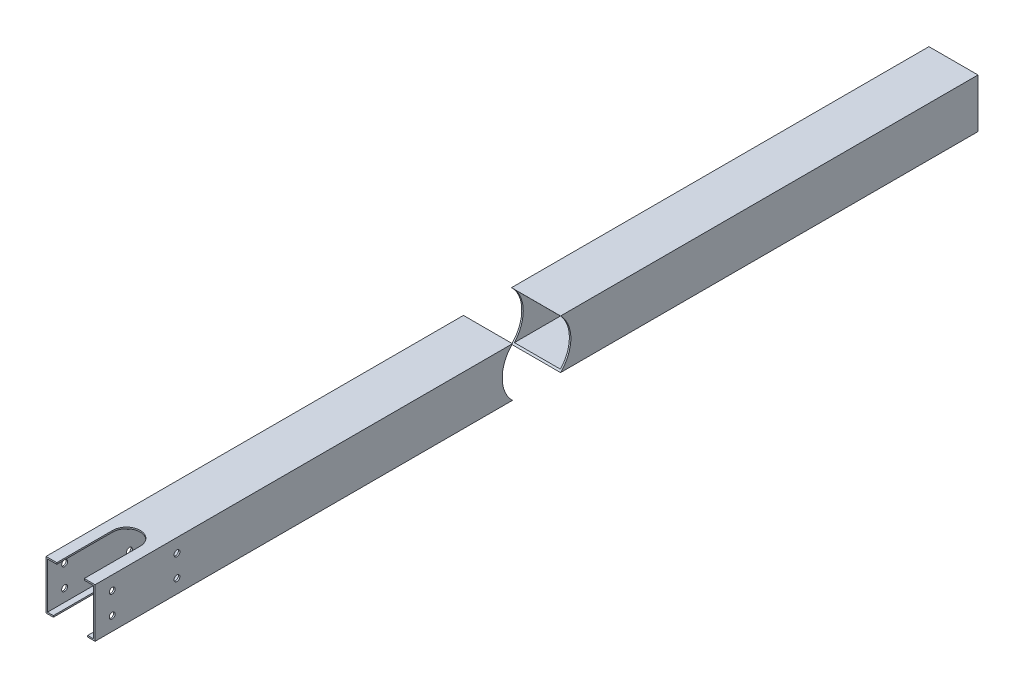
ISO-10303-21;
HEADER;
FILE_DESCRIPTION(('STEP AP214'),'2;1');
FILE_NAME('part.step','',(''),(''),'','','');
FILE_SCHEMA(('AUTOMOTIVE_DESIGN { 1 0 10303 214 1 1 1 1 }'));
ENDSEC;
DATA;
#1=APPLICATION_CONTEXT('core data for automotive mechanical design processes');
#2=APPLICATION_PROTOCOL_DEFINITION('international standard','automotive_design',2000,#1);
#3=PRODUCT_CONTEXT('',#1,'mechanical');
#4=PRODUCT('Part','Part','',(#3));
#5=PRODUCT_RELATED_PRODUCT_CATEGORY('part','',(#4));
#6=PRODUCT_DEFINITION_FORMATION('','',#4);
#7=PRODUCT_DEFINITION_CONTEXT('part definition',#1,'design');
#8=PRODUCT_DEFINITION('design','',#6,#7);
#9=PRODUCT_DEFINITION_SHAPE('','',#8);
#10=(LENGTH_UNIT() NAMED_UNIT(*) SI_UNIT(.MILLI.,.METRE.));
#11=(NAMED_UNIT(*) PLANE_ANGLE_UNIT() SI_UNIT($,.RADIAN.));
#12=(NAMED_UNIT(*) SI_UNIT($,.STERADIAN.) SOLID_ANGLE_UNIT());
#13=UNCERTAINTY_MEASURE_WITH_UNIT(LENGTH_MEASURE(1.E-05),#10,'distance_accuracy_value','');
#14=(GEOMETRIC_REPRESENTATION_CONTEXT(3) GLOBAL_UNCERTAINTY_ASSIGNED_CONTEXT((#13)) GLOBAL_UNIT_ASSIGNED_CONTEXT((#10,
#11,#12)) REPRESENTATION_CONTEXT('',''));
#15=CARTESIAN_POINT('',(0.,0.,0.));
#16=DIRECTION('',(0.,0.,1.));
#17=DIRECTION('',(1.,0.,0.));
#18=AXIS2_PLACEMENT_3D('',#15,#16,#17);
#19=CARTESIAN_POINT('',(0.,0.,900.));
#20=DIRECTION('',(0.,0.,1.));
#21=DIRECTION('',(1.,0.,0.));
#22=AXIS2_PLACEMENT_3D('',#19,#20,#21);
#23=PLANE('',#22);
#24=DIRECTION('',(0.,-1.,0.));
#25=VECTOR('',#24,1.);
#26=CARTESIAN_POINT('',(-17.4989384192182,0.,900.));
#27=LINE('',#26,#25);
#28=CARTESIAN_POINT('',(-17.4989384192182,-23.5,900.));
#29=VERTEX_POINT('',#28);
#30=CARTESIAN_POINT('',(-17.4989384192182,-25.,900.));
#31=VERTEX_POINT('',#30);
#32=EDGE_CURVE('E54',#29,#31,#27,.T.);
#33=ORIENTED_EDGE('',*,*,#32,.F.);
#34=DIRECTION('',(1.,0.,0.));
#35=VECTOR('',#34,1.);
#36=CARTESIAN_POINT('',(-23.5,-23.5,900.));
#37=LINE('',#36,#35);
#38=CARTESIAN_POINT('',(-23.5,-23.5,900.));
#39=VERTEX_POINT('',#38);
#40=EDGE_CURVE('E222',#39,#29,#37,.T.);
#41=ORIENTED_EDGE('',*,*,#40,.F.);
#42=DIRECTION('',(0.,-1.,0.));
#43=VECTOR('',#42,1.);
#44=CARTESIAN_POINT('',(-23.5,23.5,900.));
#45=LINE('',#44,#43);
#46=CARTESIAN_POINT('',(-23.5,23.5,900.));
#47=VERTEX_POINT('',#46);
#48=EDGE_CURVE('E226',#47,#39,#45,.T.);
#49=ORIENTED_EDGE('',*,*,#48,.F.);
#50=DIRECTION('',(-1.,0.,0.));
#51=VECTOR('',#50,1.);
#52=CARTESIAN_POINT('',(-23.5,23.5,900.));
#53=LINE('',#52,#51);
#54=CARTESIAN_POINT('',(-13.9999999999999,23.5,900.));
#55=VERTEX_POINT('',#54);
#56=EDGE_CURVE('E235',#55,#47,#53,.T.);
#57=ORIENTED_EDGE('',*,*,#56,.F.);
#58=DIRECTION('',(0.,-1.,0.));
#59=VECTOR('',#58,1.);
#60=CARTESIAN_POINT('',(-14.,0.,900.));
#61=LINE('',#60,#59);
#62=CARTESIAN_POINT('',(-14.,25.,900.));
#63=VERTEX_POINT('',#62);
#64=EDGE_CURVE('E70',#63,#55,#61,.T.);
#65=ORIENTED_EDGE('',*,*,#64,.F.);
#66=DIRECTION('',(-1.,0.,0.));
#67=VECTOR('',#66,1.);
#68=CARTESIAN_POINT('',(-25.,25.,900.));
#69=LINE('',#68,#67);
#70=CARTESIAN_POINT('',(-25.,25.,900.));
#71=VERTEX_POINT('',#70);
#72=EDGE_CURVE('E217',#63,#71,#69,.T.);
#73=ORIENTED_EDGE('',*,*,#72,.T.);
#74=DIRECTION('',(0.,-1.,0.));
#75=VECTOR('',#74,1.);
#76=CARTESIAN_POINT('',(-25.,25.,900.));
#77=LINE('',#76,#75);
#78=CARTESIAN_POINT('',(-25.,-25.,900.));
#79=VERTEX_POINT('',#78);
#80=EDGE_CURVE('E212',#71,#79,#77,.T.);
#81=ORIENTED_EDGE('',*,*,#80,.T.);
#82=DIRECTION('',(1.,0.,0.));
#83=VECTOR('',#82,1.);
#84=CARTESIAN_POINT('',(-25.,-25.,900.));
#85=LINE('',#84,#83);
#86=EDGE_CURVE('E208',#79,#31,#85,.T.);
#87=ORIENTED_EDGE('',*,*,#86,.T.);
#88=EDGE_LOOP('',(#33,#41,#49,#57,#65,#73,#81,#87));
#89=FACE_BOUND('',#88,.T.);
#90=ADVANCED_FACE('F45',(#89),#23,.T.);
#91=CARTESIAN_POINT('',(25.,25.,900.));
#92=DIRECTION('',(-1.,0.,0.));
#93=DIRECTION('',(0.,-1.,0.));
#94=AXIS2_PLACEMENT_3D('',#91,#92,#93);
#95=PLANE('',#94);
#96=CARTESIAN_POINT('',(25.,11.,816.5));
#97=DIRECTION('',(1.,0.,0.));
#98=DIRECTION('',(0.,-1.,0.));
#99=AXIS2_PLACEMENT_3D('',#96,#97,#98);
#100=CIRCLE('',#99,3.00000000000005);
#101=CARTESIAN_POINT('',(25.,7.99999999999995,816.5));
#102=VERTEX_POINT('',#101);
#103=EDGE_CURVE('E439',#102,#102,#100,.T.);
#104=ORIENTED_EDGE('',*,*,#103,.F.);
#105=EDGE_LOOP('',(#104));
#106=FACE_BOUND('',#105,.T.);
#107=CARTESIAN_POINT('',(25.,-11.,816.5));
#108=DIRECTION('',(1.,0.,0.));
#109=DIRECTION('',(0.,-1.,0.));
#110=AXIS2_PLACEMENT_3D('',#107,#108,#109);
#111=CIRCLE('',#110,3.00000000000005);
#112=CARTESIAN_POINT('',(25.,-14.0000000000001,816.5));
#113=VERTEX_POINT('',#112);
#114=EDGE_CURVE('E442',#113,#113,#111,.T.);
#115=ORIENTED_EDGE('',*,*,#114,.F.);
#116=EDGE_LOOP('',(#115));
#117=FACE_BOUND('',#116,.T.);
#118=CARTESIAN_POINT('',(25.,-11.,882.5));
#119=DIRECTION('',(1.,0.,0.));
#120=DIRECTION('',(0.,1.,0.));
#121=AXIS2_PLACEMENT_3D('',#118,#119,#120);
#122=CIRCLE('',#121,3.00000000000005);
#123=CARTESIAN_POINT('',(25.,-7.99999999999996,882.5));
#124=VERTEX_POINT('',#123);
#125=EDGE_CURVE('E438',#124,#124,#122,.T.);
#126=ORIENTED_EDGE('',*,*,#125,.F.);
#127=EDGE_LOOP('',(#126));
#128=FACE_BOUND('',#127,.T.);
#129=CARTESIAN_POINT('',(25.,11.,882.5));
#130=DIRECTION('',(1.,0.,0.));
#131=DIRECTION('',(0.,1.,0.));
#132=AXIS2_PLACEMENT_3D('',#129,#130,#131);
#133=CIRCLE('',#132,3.00000000000005);
#134=CARTESIAN_POINT('',(25.,14.,882.5));
#135=VERTEX_POINT('',#134);
#136=EDGE_CURVE('E284',#135,#135,#133,.T.);
#137=ORIENTED_EDGE('',*,*,#136,.F.);
#138=EDGE_LOOP('',(#137));
#139=FACE_BOUND('',#138,.T.);
#140=DIRECTION('',(0.,0.,-1.));
#141=VECTOR('',#140,1.);
#142=CARTESIAN_POINT('',(25.,-25.,900.));
#143=LINE('',#142,#141);
#144=CARTESIAN_POINT('',(25.,-25.,900.));
#145=VERTEX_POINT('',#144);
#146=CARTESIAN_POINT('',(25.,-25.,474.494897427832));
#147=VERTEX_POINT('',#146);
#148=EDGE_CURVE('E203',#145,#147,#143,.T.);
#149=ORIENTED_EDGE('',*,*,#148,.T.);
#150=CARTESIAN_POINT('',(25.,0.,450.));
#151=DIRECTION('',(1.,0.,0.));
#152=DIRECTION('',(0.,1.,0.));
#153=AXIS2_PLACEMENT_3D('',#150,#151,#152);
#154=CIRCLE('',#153,35.);
#155=CARTESIAN_POINT('',(25.,25.,474.494897427832));
#156=VERTEX_POINT('',#155);
#157=EDGE_CURVE('E206',#156,#147,#154,.T.);
#158=ORIENTED_EDGE('',*,*,#157,.F.);
#159=DIRECTION('',(0.,0.,-1.));
#160=VECTOR('',#159,1.);
#161=CARTESIAN_POINT('',(25.,25.,900.));
#162=LINE('',#161,#160);
#163=CARTESIAN_POINT('',(25.,25.,900.));
#164=VERTEX_POINT('',#163);
#165=EDGE_CURVE('E211',#164,#156,#162,.T.);
#166=ORIENTED_EDGE('',*,*,#165,.F.);
#167=DIRECTION('',(0.,1.,0.));
#168=VECTOR('',#167,1.);
#169=CARTESIAN_POINT('',(25.,25.,900.));
#170=LINE('',#169,#168);
#171=EDGE_CURVE('E218',#145,#164,#170,.T.);
#172=ORIENTED_EDGE('',*,*,#171,.F.);
#173=EDGE_LOOP('',(#149,#158,#166,#172));
#174=FACE_BOUND('',#173,.T.);
#175=ADVANCED_FACE('F338',(#106,#117,#128,#139,#174),#95,.F.);
#176=CARTESIAN_POINT('',(-25.,25.,900.));
#177=DIRECTION('',(1.,0.,0.));
#178=DIRECTION('',(0.,1.,0.));
#179=AXIS2_PLACEMENT_3D('',#176,#177,#178);
#180=PLANE('',#179);
#181=CARTESIAN_POINT('',(-25.,11.,816.5));
#182=DIRECTION('',(1.,0.,0.));
#183=DIRECTION('',(0.,1.,0.));
#184=AXIS2_PLACEMENT_3D('',#181,#182,#183);
#185=CIRCLE('',#184,3.00000000000005);
#186=CARTESIAN_POINT('',(-25.,14.,816.5));
#187=VERTEX_POINT('',#186);
#188=EDGE_CURVE('E174',#187,#187,#185,.T.);
#189=ORIENTED_EDGE('',*,*,#188,.T.);
#190=EDGE_LOOP('',(#189));
#191=FACE_BOUND('',#190,.T.);
#192=CARTESIAN_POINT('',(-25.,-11.,816.5));
#193=DIRECTION('',(1.,0.,0.));
#194=DIRECTION('',(0.,1.,0.));
#195=AXIS2_PLACEMENT_3D('',#192,#193,#194);
#196=CIRCLE('',#195,3.00000000000005);
#197=CARTESIAN_POINT('',(-25.,-7.99999999999996,816.5));
#198=VERTEX_POINT('',#197);
#199=EDGE_CURVE('E296',#198,#198,#196,.T.);
#200=ORIENTED_EDGE('',*,*,#199,.T.);
#201=EDGE_LOOP('',(#200));
#202=FACE_BOUND('',#201,.T.);
#203=CARTESIAN_POINT('',(-25.,-11.,882.5));
#204=DIRECTION('',(1.,0.,0.));
#205=DIRECTION('',(0.,1.,0.));
#206=AXIS2_PLACEMENT_3D('',#203,#204,#205);
#207=CIRCLE('',#206,3.00000000000005);
#208=CARTESIAN_POINT('',(-25.,-7.99999999999996,882.5));
#209=VERTEX_POINT('',#208);
#210=EDGE_CURVE('E292',#209,#209,#207,.T.);
#211=ORIENTED_EDGE('',*,*,#210,.T.);
#212=EDGE_LOOP('',(#211));
#213=FACE_BOUND('',#212,.T.);
#214=CARTESIAN_POINT('',(-25.,11.,882.5));
#215=DIRECTION('',(1.,0.,0.));
#216=DIRECTION('',(0.,1.,0.));
#217=AXIS2_PLACEMENT_3D('',#214,#215,#216);
#218=CIRCLE('',#217,3.00000000000005);
#219=CARTESIAN_POINT('',(-25.,14.,882.5));
#220=VERTEX_POINT('',#219);
#221=EDGE_CURVE('E288',#220,#220,#218,.T.);
#222=ORIENTED_EDGE('',*,*,#221,.T.);
#223=EDGE_LOOP('',(#222));
#224=FACE_BOUND('',#223,.T.);
#225=DIRECTION('',(0.,0.,-1.));
#226=VECTOR('',#225,1.);
#227=CARTESIAN_POINT('',(-25.,25.,900.));
#228=LINE('',#227,#226);
#229=CARTESIAN_POINT('',(-25.,25.,474.494897427832));
#230=VERTEX_POINT('',#229);
#231=EDGE_CURVE('E250',#71,#230,#228,.T.);
#232=ORIENTED_EDGE('',*,*,#231,.T.);
#233=CARTESIAN_POINT('',(-25.,0.,450.));
#234=DIRECTION('',(1.,0.,0.));
#235=DIRECTION('',(0.,1.,0.));
#236=AXIS2_PLACEMENT_3D('',#233,#234,#235);
#237=CIRCLE('',#236,35.);
#238=CARTESIAN_POINT('',(-25.,-25.,474.494897427832));
#239=VERTEX_POINT('',#238);
#240=EDGE_CURVE('E253',#230,#239,#237,.T.);
#241=ORIENTED_EDGE('',*,*,#240,.T.);
#242=DIRECTION('',(0.,0.,-1.));
#243=VECTOR('',#242,1.);
#244=CARTESIAN_POINT('',(-25.,-25.,900.));
#245=LINE('',#244,#243);
#246=EDGE_CURVE('E244',#79,#239,#245,.T.);
#247=ORIENTED_EDGE('',*,*,#246,.F.);
#248=ORIENTED_EDGE('',*,*,#80,.F.);
#249=EDGE_LOOP('',(#232,#241,#247,#248));
#250=FACE_BOUND('',#249,.T.);
#251=ADVANCED_FACE('F313',(#191,#202,#213,#224,#250),#180,.F.);
#252=CARTESIAN_POINT('',(-25.,-25.,900.));
#253=DIRECTION('',(0.,1.,0.));
#254=DIRECTION('',(0.,0.,1.));
#255=AXIS2_PLACEMENT_3D('',#252,#253,#254);
#256=PLANE('',#255);
#257=CARTESIAN_POINT('',(0.0010615807817943,-25.,850.));
#258=DIRECTION('',(0.,-1.,0.));
#259=DIRECTION('',(0.,0.,-1.));
#260=AXIS2_PLACEMENT_3D('',#257,#258,#259);
#261=CIRCLE('',#260,17.5);
#262=CARTESIAN_POINT('',(-17.4989384192182,-25.,850.));
#263=VERTEX_POINT('',#262);
#264=CARTESIAN_POINT('',(17.5010615807818,-25.,850.));
#265=VERTEX_POINT('',#264);
#266=EDGE_CURVE('E168',#263,#265,#261,.T.);
#267=ORIENTED_EDGE('',*,*,#266,.F.);
#268=DIRECTION('',(0.,0.,-1.));
#269=VECTOR('',#268,1.);
#270=CARTESIAN_POINT('',(-17.4989384192182,-25.,850.));
#271=LINE('',#270,#269);
#272=EDGE_CURVE('E165',#31,#263,#271,.T.);
#273=ORIENTED_EDGE('',*,*,#272,.F.);
#274=ORIENTED_EDGE('',*,*,#86,.F.);
#275=ORIENTED_EDGE('',*,*,#246,.T.);
#276=DIRECTION('',(1.,0.,0.));
#277=VECTOR('',#276,1.);
#278=CARTESIAN_POINT('',(-34.,-25.,474.494897427832));
#279=LINE('',#278,#277);
#280=EDGE_CURVE('E238',#239,#147,#279,.T.);
#281=ORIENTED_EDGE('',*,*,#280,.T.);
#282=ORIENTED_EDGE('',*,*,#148,.F.);
#283=CARTESIAN_POINT('',(17.5010615807818,-25.,900.));
#284=VERTEX_POINT('',#283);
#285=EDGE_CURVE('E179',#284,#145,#85,.T.);
#286=ORIENTED_EDGE('',*,*,#285,.F.);
#287=DIRECTION('',(0.,0.,1.));
#288=VECTOR('',#287,1.);
#289=CARTESIAN_POINT('',(17.5010615807818,-25.,850.));
#290=LINE('',#289,#288);
#291=EDGE_CURVE('E62',#265,#284,#290,.T.);
#292=ORIENTED_EDGE('',*,*,#291,.F.);
#293=EDGE_LOOP('',(#267,#273,#274,#275,#281,#282,#286,#292));
#294=FACE_BOUND('',#293,.T.);
#295=ADVANCED_FACE('F177',(#294),#256,.F.);
#296=CARTESIAN_POINT('',(23.5,23.5,900.));
#297=DIRECTION('',(-1.,0.,0.));
#298=DIRECTION('',(0.,-1.,0.));
#299=AXIS2_PLACEMENT_3D('',#296,#297,#298);
#300=PLANE('',#299);
#301=CARTESIAN_POINT('',(23.5,11.,816.5));
#302=DIRECTION('',(-1.,0.,0.));
#303=DIRECTION('',(0.,-1.,0.));
#304=AXIS2_PLACEMENT_3D('',#301,#302,#303);
#305=CIRCLE('',#304,3.00000000000005);
#306=CARTESIAN_POINT('',(23.5,7.99999999999995,816.5));
#307=VERTEX_POINT('',#306);
#308=EDGE_CURVE('E308',#307,#307,#305,.T.);
#309=ORIENTED_EDGE('',*,*,#308,.F.);
#310=EDGE_LOOP('',(#309));
#311=FACE_BOUND('',#310,.T.);
#312=CARTESIAN_POINT('',(23.5,-11.,816.5));
#313=DIRECTION('',(-1.,0.,0.));
#314=DIRECTION('',(0.,-1.,0.));
#315=AXIS2_PLACEMENT_3D('',#312,#313,#314);
#316=CIRCLE('',#315,3.00000000000005);
#317=CARTESIAN_POINT('',(23.5,-14.0000000000001,816.5));
#318=VERTEX_POINT('',#317);
#319=EDGE_CURVE('E291',#318,#318,#316,.T.);
#320=ORIENTED_EDGE('',*,*,#319,.F.);
#321=EDGE_LOOP('',(#320));
#322=FACE_BOUND('',#321,.T.);
#323=CARTESIAN_POINT('',(23.5,-11.,882.5));
#324=DIRECTION('',(-1.,0.,0.));
#325=DIRECTION('',(0.,-1.,0.));
#326=AXIS2_PLACEMENT_3D('',#323,#324,#325);
#327=CIRCLE('',#326,3.00000000000005);
#328=CARTESIAN_POINT('',(23.5,-14.0000000000001,882.5));
#329=VERTEX_POINT('',#328);
#330=EDGE_CURVE('E287',#329,#329,#327,.T.);
#331=ORIENTED_EDGE('',*,*,#330,.F.);
#332=EDGE_LOOP('',(#331));
#333=FACE_BOUND('',#332,.T.);
#334=CARTESIAN_POINT('',(23.5,11.,882.5));
#335=DIRECTION('',(-1.,0.,0.));
#336=DIRECTION('',(0.,-1.,0.));
#337=AXIS2_PLACEMENT_3D('',#334,#335,#336);
#338=CIRCLE('',#337,3.00000000000005);
#339=CARTESIAN_POINT('',(23.5,7.99999999999995,882.5));
#340=VERTEX_POINT('',#339);
#341=EDGE_CURVE('E283',#340,#340,#338,.T.);
#342=ORIENTED_EDGE('',*,*,#341,.F.);
#343=EDGE_LOOP('',(#342));
#344=FACE_BOUND('',#343,.T.);
#345=CARTESIAN_POINT('',(23.5,0.,450.));
#346=DIRECTION('',(-1.,0.,0.));
#347=DIRECTION('',(0.,-1.,0.));
#348=AXIS2_PLACEMENT_3D('',#345,#346,#347);
#349=CIRCLE('',#348,35.);
#350=CARTESIAN_POINT('',(23.5,-23.5,475.937424698686));
#351=VERTEX_POINT('',#350);
#352=CARTESIAN_POINT('',(23.5,23.5,475.937424698686));
#353=VERTEX_POINT('',#352);
#354=EDGE_CURVE('E247',#351,#353,#349,.T.);
#355=ORIENTED_EDGE('',*,*,#354,.F.);
#356=DIRECTION('',(0.,0.,-1.));
#357=VECTOR('',#356,1.);
#358=CARTESIAN_POINT('',(23.5,-23.5,900.));
#359=LINE('',#358,#357);
#360=CARTESIAN_POINT('',(23.5,-23.5,900.));
#361=VERTEX_POINT('',#360);
#362=EDGE_CURVE('E221',#361,#351,#359,.T.);
#363=ORIENTED_EDGE('',*,*,#362,.F.);
#364=DIRECTION('',(0.,1.,0.));
#365=VECTOR('',#364,1.);
#366=CARTESIAN_POINT('',(23.5,23.5,900.));
#367=LINE('',#366,#365);
#368=CARTESIAN_POINT('',(23.5,23.5,900.));
#369=VERTEX_POINT('',#368);
#370=EDGE_CURVE('E236',#361,#369,#367,.T.);
#371=ORIENTED_EDGE('',*,*,#370,.T.);
#372=DIRECTION('',(0.,0.,-1.));
#373=VECTOR('',#372,1.);
#374=CARTESIAN_POINT('',(23.5,23.5,900.));
#375=LINE('',#374,#373);
#376=EDGE_CURVE('E230',#369,#353,#375,.T.);
#377=ORIENTED_EDGE('',*,*,#376,.T.);
#378=EDGE_LOOP('',(#355,#363,#371,#377));
#379=FACE_BOUND('',#378,.T.);
#380=ADVANCED_FACE('F397',(#311,#322,#333,#344,#379),#300,.T.);
#381=CARTESIAN_POINT('',(-23.5,23.5,900.));
#382=DIRECTION('',(1.,0.,0.));
#383=DIRECTION('',(0.,1.,0.));
#384=AXIS2_PLACEMENT_3D('',#381,#382,#383);
#385=PLANE('',#384);
#386=CARTESIAN_POINT('',(-23.5,11.,816.5));
#387=DIRECTION('',(1.,0.,0.));
#388=DIRECTION('',(0.,1.,0.));
#389=AXIS2_PLACEMENT_3D('',#386,#387,#388);
#390=CIRCLE('',#389,3.00000000000005);
#391=CARTESIAN_POINT('',(-23.5,14.,816.5));
#392=VERTEX_POINT('',#391);
#393=EDGE_CURVE('E49',#392,#392,#390,.T.);
#394=ORIENTED_EDGE('',*,*,#393,.F.);
#395=EDGE_LOOP('',(#394));
#396=FACE_BOUND('',#395,.T.);
#397=CARTESIAN_POINT('',(-23.5,-11.,816.5));
#398=DIRECTION('',(1.,0.,0.));
#399=DIRECTION('',(0.,1.,0.));
#400=AXIS2_PLACEMENT_3D('',#397,#398,#399);
#401=CIRCLE('',#400,3.00000000000005);
#402=CARTESIAN_POINT('',(-23.5,-7.99999999999996,816.5));
#403=VERTEX_POINT('',#402);
#404=EDGE_CURVE('E289',#403,#403,#401,.T.);
#405=ORIENTED_EDGE('',*,*,#404,.F.);
#406=EDGE_LOOP('',(#405));
#407=FACE_BOUND('',#406,.T.);
#408=CARTESIAN_POINT('',(-23.5,-11.,882.5));
#409=DIRECTION('',(1.,0.,0.));
#410=DIRECTION('',(0.,1.,0.));
#411=AXIS2_PLACEMENT_3D('',#408,#409,#410);
#412=CIRCLE('',#411,3.00000000000005);
#413=CARTESIAN_POINT('',(-23.5,-7.99999999999996,882.5));
#414=VERTEX_POINT('',#413);
#415=EDGE_CURVE('E285',#414,#414,#412,.T.);
#416=ORIENTED_EDGE('',*,*,#415,.F.);
#417=EDGE_LOOP('',(#416));
#418=FACE_BOUND('',#417,.T.);
#419=CARTESIAN_POINT('',(-23.5,11.,882.5));
#420=DIRECTION('',(1.,0.,0.));
#421=DIRECTION('',(0.,1.,0.));
#422=AXIS2_PLACEMENT_3D('',#419,#420,#421);
#423=CIRCLE('',#422,3.00000000000005);
#424=CARTESIAN_POINT('',(-23.5,14.,882.5));
#425=VERTEX_POINT('',#424);
#426=EDGE_CURVE('E280',#425,#425,#423,.T.);
#427=ORIENTED_EDGE('',*,*,#426,.F.);
#428=EDGE_LOOP('',(#427));
#429=FACE_BOUND('',#428,.T.);
#430=CARTESIAN_POINT('',(-23.5,0.,450.));
#431=DIRECTION('',(1.,0.,0.));
#432=DIRECTION('',(0.,1.,0.));
#433=AXIS2_PLACEMENT_3D('',#430,#431,#432);
#434=CIRCLE('',#433,35.);
#435=CARTESIAN_POINT('',(-23.5,23.5,475.937424698686));
#436=VERTEX_POINT('',#435);
#437=CARTESIAN_POINT('',(-23.5,-23.5,475.937424698686));
#438=VERTEX_POINT('',#437);
#439=EDGE_CURVE('E207',#436,#438,#434,.T.);
#440=ORIENTED_EDGE('',*,*,#439,.F.);
#441=DIRECTION('',(0.,0.,-1.));
#442=VECTOR('',#441,1.);
#443=CARTESIAN_POINT('',(-23.5,23.5,900.));
#444=LINE('',#443,#442);
#445=EDGE_CURVE('E234',#47,#436,#444,.T.);
#446=ORIENTED_EDGE('',*,*,#445,.F.);
#447=ORIENTED_EDGE('',*,*,#48,.T.);
#448=DIRECTION('',(0.,0.,-1.));
#449=VECTOR('',#448,1.);
#450=CARTESIAN_POINT('',(-23.5,-23.5,900.));
#451=LINE('',#450,#449);
#452=EDGE_CURVE('E229',#39,#438,#451,.T.);
#453=ORIENTED_EDGE('',*,*,#452,.T.);
#454=EDGE_LOOP('',(#440,#446,#447,#453));
#455=FACE_BOUND('',#454,.T.);
#456=ADVANCED_FACE('F361',(#396,#407,#418,#429,#455),#385,.T.);
#457=CARTESIAN_POINT('',(-23.5,-23.5,900.));
#458=DIRECTION('',(0.,1.,0.));
#459=DIRECTION('',(0.,0.,1.));
#460=AXIS2_PLACEMENT_3D('',#457,#458,#459);
#461=PLANE('',#460);
#462=DIRECTION('',(0.,0.,1.));
#463=VECTOR('',#462,1.);
#464=CARTESIAN_POINT('',(-17.4989384192182,-23.5,900.));
#465=LINE('',#464,#463);
#466=CARTESIAN_POINT('',(-17.4989384192182,-23.5,850.));
#467=VERTEX_POINT('',#466);
#468=EDGE_CURVE('E186',#467,#29,#465,.T.);
#469=ORIENTED_EDGE('',*,*,#468,.F.);
#470=CARTESIAN_POINT('',(0.0010615807817943,-23.5,850.));
#471=DIRECTION('',(0.,1.,0.));
#472=DIRECTION('',(0.,0.,1.));
#473=AXIS2_PLACEMENT_3D('',#470,#471,#472);
#474=CIRCLE('',#473,17.5);
#475=CARTESIAN_POINT('',(17.5010615807818,-23.5,850.));
#476=VERTEX_POINT('',#475);
#477=EDGE_CURVE('E12',#476,#467,#474,.T.);
#478=ORIENTED_EDGE('',*,*,#477,.F.);
#479=DIRECTION('',(0.,0.,-1.));
#480=VECTOR('',#479,1.);
#481=CARTESIAN_POINT('',(17.5010615807818,-23.5,900.));
#482=LINE('',#481,#480);
#483=CARTESIAN_POINT('',(17.5010615807818,-23.5,900.));
#484=VERTEX_POINT('',#483);
#485=EDGE_CURVE('E161',#484,#476,#482,.T.);
#486=ORIENTED_EDGE('',*,*,#485,.F.);
#487=EDGE_CURVE('E225',#484,#361,#37,.T.);
#488=ORIENTED_EDGE('',*,*,#487,.T.);
#489=ORIENTED_EDGE('',*,*,#362,.T.);
#490=DIRECTION('',(1.,0.,0.));
#491=VECTOR('',#490,1.);
#492=CARTESIAN_POINT('',(-34.,-23.5,475.937424698686));
#493=LINE('',#492,#491);
#494=EDGE_CURVE('E204',#438,#351,#493,.T.);
#495=ORIENTED_EDGE('',*,*,#494,.F.);
#496=ORIENTED_EDGE('',*,*,#452,.F.);
#497=ORIENTED_EDGE('',*,*,#40,.T.);
#498=EDGE_LOOP('',(#469,#478,#486,#488,#489,#495,#496,#497));
#499=FACE_BOUND('',#498,.T.);
#500=ADVANCED_FACE('F352',(#499),#461,.T.);
#501=DIRECTION('',(0.,1.,0.));
#502=VECTOR('',#501,1.);
#503=CARTESIAN_POINT('',(17.5010615807818,0.,900.));
#504=LINE('',#503,#502);
#505=EDGE_CURVE('E277',#284,#484,#504,.T.);
#506=ORIENTED_EDGE('',*,*,#505,.F.);
#507=ORIENTED_EDGE('',*,*,#285,.T.);
#508=ORIENTED_EDGE('',*,*,#171,.T.);
#509=CARTESIAN_POINT('',(14.,25.,900.));
#510=VERTEX_POINT('',#509);
#511=EDGE_CURVE('E214',#164,#510,#69,.T.);
#512=ORIENTED_EDGE('',*,*,#511,.T.);
#513=DIRECTION('',(0.,1.,0.));
#514=VECTOR('',#513,1.);
#515=CARTESIAN_POINT('',(14.,0.,900.));
#516=LINE('',#515,#514);
#517=CARTESIAN_POINT('',(14.,23.5,900.));
#518=VERTEX_POINT('',#517);
#519=EDGE_CURVE('E201',#518,#510,#516,.T.);
#520=ORIENTED_EDGE('',*,*,#519,.F.);
#521=EDGE_CURVE('E231',#369,#518,#53,.T.);
#522=ORIENTED_EDGE('',*,*,#521,.F.);
#523=ORIENTED_EDGE('',*,*,#370,.F.);
#524=ORIENTED_EDGE('',*,*,#487,.F.);
#525=EDGE_LOOP('',(#506,#507,#508,#512,#520,#522,#523,#524));
#526=FACE_BOUND('',#525,.T.);
#527=ADVANCED_FACE('F341',(#526),#23,.T.);
#528=CARTESIAN_POINT('',(-25.,25.,900.));
#529=DIRECTION('',(0.,-1.,0.));
#530=DIRECTION('',(0.,0.,-1.));
#531=AXIS2_PLACEMENT_3D('',#528,#529,#530);
#532=PLANE('',#531);
#533=CARTESIAN_POINT('',(0.,25.,843.));
#534=DIRECTION('',(0.,1.,0.));
#535=DIRECTION('',(0.,0.,1.));
#536=AXIS2_PLACEMENT_3D('',#533,#534,#535);
#537=CIRCLE('',#536,13.9999999999999);
#538=CARTESIAN_POINT('',(13.9999999999999,25.,843.));
#539=VERTEX_POINT('',#538);
#540=CARTESIAN_POINT('',(-13.9999999999999,25.,843.));
#541=VERTEX_POINT('',#540);
#542=EDGE_CURVE('E188',#539,#541,#537,.T.);
#543=ORIENTED_EDGE('',*,*,#542,.F.);
#544=DIRECTION('',(0.,0.,-1.));
#545=VECTOR('',#544,1.);
#546=CARTESIAN_POINT('',(13.9999999999999,25.,843.));
#547=LINE('',#546,#545);
#548=EDGE_CURVE('E193',#510,#539,#547,.T.);
#549=ORIENTED_EDGE('',*,*,#548,.F.);
#550=ORIENTED_EDGE('',*,*,#511,.F.);
#551=ORIENTED_EDGE('',*,*,#165,.T.);
#552=DIRECTION('',(1.,0.,0.));
#553=VECTOR('',#552,1.);
#554=CARTESIAN_POINT('',(-34.,25.,474.494897427832));
#555=LINE('',#554,#553);
#556=EDGE_CURVE('E239',#156,#230,#555,.F.);
#557=ORIENTED_EDGE('',*,*,#556,.T.);
#558=ORIENTED_EDGE('',*,*,#231,.F.);
#559=ORIENTED_EDGE('',*,*,#72,.F.);
#560=DIRECTION('',(0.,0.,1.));
#561=VECTOR('',#560,1.);
#562=CARTESIAN_POINT('',(-13.9999999999999,25.,843.));
#563=LINE('',#562,#561);
#564=EDGE_CURVE('E191',#541,#63,#563,.T.);
#565=ORIENTED_EDGE('',*,*,#564,.F.);
#566=EDGE_LOOP('',(#543,#549,#550,#551,#557,#558,#559,#565));
#567=FACE_BOUND('',#566,.T.);
#568=ADVANCED_FACE('F351',(#567),#532,.F.);
#569=CARTESIAN_POINT('',(-23.5,23.5,900.));
#570=DIRECTION('',(0.,-1.,0.));
#571=DIRECTION('',(0.,0.,-1.));
#572=AXIS2_PLACEMENT_3D('',#569,#570,#571);
#573=PLANE('',#572);
#574=DIRECTION('',(0.,0.,1.));
#575=VECTOR('',#574,1.);
#576=CARTESIAN_POINT('',(14.,23.5,900.));
#577=LINE('',#576,#575);
#578=CARTESIAN_POINT('',(13.9999999999999,23.5,843.));
#579=VERTEX_POINT('',#578);
#580=EDGE_CURVE('E275',#579,#518,#577,.T.);
#581=ORIENTED_EDGE('',*,*,#580,.F.);
#582=CARTESIAN_POINT('',(0.,23.5,843.));
#583=DIRECTION('',(0.,-1.,0.));
#584=DIRECTION('',(0.,0.,-1.));
#585=AXIS2_PLACEMENT_3D('',#582,#583,#584);
#586=CIRCLE('',#585,13.9999999999999);
#587=CARTESIAN_POINT('',(-13.9999999999999,23.5,843.));
#588=VERTEX_POINT('',#587);
#589=EDGE_CURVE('E273',#588,#579,#586,.T.);
#590=ORIENTED_EDGE('',*,*,#589,.F.);
#591=DIRECTION('',(0.,0.,-1.));
#592=VECTOR('',#591,1.);
#593=CARTESIAN_POINT('',(-14.,23.5,900.));
#594=LINE('',#593,#592);
#595=EDGE_CURVE('E271',#55,#588,#594,.T.);
#596=ORIENTED_EDGE('',*,*,#595,.F.);
#597=ORIENTED_EDGE('',*,*,#56,.T.);
#598=ORIENTED_EDGE('',*,*,#445,.T.);
#599=DIRECTION('',(1.,0.,0.));
#600=VECTOR('',#599,1.);
#601=CARTESIAN_POINT('',(-34.,23.5,475.937424698686));
#602=LINE('',#601,#600);
#603=EDGE_CURVE('E245',#353,#436,#602,.F.);
#604=ORIENTED_EDGE('',*,*,#603,.F.);
#605=ORIENTED_EDGE('',*,*,#376,.F.);
#606=ORIENTED_EDGE('',*,*,#521,.T.);
#607=EDGE_LOOP('',(#581,#590,#596,#597,#598,#604,#605,#606));
#608=FACE_BOUND('',#607,.T.);
#609=ADVANCED_FACE('F358',(#608),#573,.T.);
#610=CARTESIAN_POINT('',(-34.,0.,450.));
#611=DIRECTION('',(1.,0.,0.));
#612=DIRECTION('',(0.,1.,0.));
#613=AXIS2_PLACEMENT_3D('',#610,#611,#612);
#614=CYLINDRICAL_SURFACE('',#613,35.);
#615=ORIENTED_EDGE('',*,*,#354,.T.);
#616=ORIENTED_EDGE('',*,*,#603,.T.);
#617=ORIENTED_EDGE('',*,*,#439,.T.);
#618=ORIENTED_EDGE('',*,*,#494,.T.);
#619=EDGE_LOOP('',(#615,#616,#617,#618));
#620=FACE_BOUND('',#619,.T.);
#621=ORIENTED_EDGE('',*,*,#157,.T.);
#622=ORIENTED_EDGE('',*,*,#280,.F.);
#623=ORIENTED_EDGE('',*,*,#240,.F.);
#624=ORIENTED_EDGE('',*,*,#556,.F.);
#625=EDGE_LOOP('',(#621,#622,#623,#624));
#626=FACE_BOUND('',#625,.T.);
#627=ADVANCED_FACE('F47',(#620,#626),#614,.F.);
#628=CARTESIAN_POINT('',(0.,15.,843.));
#629=DIRECTION('',(0.,1.,0.));
#630=DIRECTION('',(0.,0.,1.));
#631=AXIS2_PLACEMENT_3D('',#628,#629,#630);
#632=CYLINDRICAL_SURFACE('',#631,13.9999999999999);
#633=ORIENTED_EDGE('',*,*,#589,.T.);
#634=DIRECTION('',(0.,1.,0.));
#635=VECTOR('',#634,1.);
#636=CARTESIAN_POINT('',(13.9999999999999,15.,843.));
#637=LINE('',#636,#635);
#638=EDGE_CURVE('E197',#579,#539,#637,.T.);
#639=ORIENTED_EDGE('',*,*,#638,.T.);
#640=ORIENTED_EDGE('',*,*,#542,.T.);
#641=DIRECTION('',(0.,1.,0.));
#642=VECTOR('',#641,1.);
#643=CARTESIAN_POINT('',(-13.9999999999999,15.,843.));
#644=LINE('',#643,#642);
#645=EDGE_CURVE('E196',#588,#541,#644,.T.);
#646=ORIENTED_EDGE('',*,*,#645,.F.);
#647=EDGE_LOOP('',(#633,#639,#640,#646));
#648=FACE_BOUND('',#647,.T.);
#649=ADVANCED_FACE('F408',(#648),#632,.F.);
#650=CARTESIAN_POINT('',(13.9999999999999,15.,843.));
#651=DIRECTION('',(1.,0.,0.));
#652=DIRECTION('',(0.,0.,-1.));
#653=AXIS2_PLACEMENT_3D('',#650,#651,#652);
#654=PLANE('',#653);
#655=ORIENTED_EDGE('',*,*,#519,.T.);
#656=ORIENTED_EDGE('',*,*,#548,.T.);
#657=ORIENTED_EDGE('',*,*,#638,.F.);
#658=ORIENTED_EDGE('',*,*,#580,.T.);
#659=EDGE_LOOP('',(#655,#656,#657,#658));
#660=FACE_BOUND('',#659,.T.);
#661=ADVANCED_FACE('F389',(#660),#654,.F.);
#662=CARTESIAN_POINT('',(-13.9999999999999,15.,843.));
#663=DIRECTION('',(-1.,0.,0.));
#664=DIRECTION('',(0.,0.,1.));
#665=AXIS2_PLACEMENT_3D('',#662,#663,#664);
#666=PLANE('',#665);
#667=ORIENTED_EDGE('',*,*,#64,.T.);
#668=ORIENTED_EDGE('',*,*,#595,.T.);
#669=ORIENTED_EDGE('',*,*,#645,.T.);
#670=ORIENTED_EDGE('',*,*,#564,.T.);
#671=EDGE_LOOP('',(#667,#668,#669,#670));
#672=FACE_BOUND('',#671,.T.);
#673=ADVANCED_FACE('F406',(#672),#666,.F.);
#674=CARTESIAN_POINT('',(0.0010615807817943,-15.,850.));
#675=DIRECTION('',(0.,-1.,0.));
#676=DIRECTION('',(0.,0.,-1.));
#677=AXIS2_PLACEMENT_3D('',#674,#675,#676);
#678=CYLINDRICAL_SURFACE('',#677,17.5);
#679=ORIENTED_EDGE('',*,*,#477,.T.);
#680=DIRECTION('',(0.,-1.,0.));
#681=VECTOR('',#680,1.);
#682=CARTESIAN_POINT('',(-17.4989384192182,-15.,850.));
#683=LINE('',#682,#681);
#684=EDGE_CURVE('E164',#467,#263,#683,.T.);
#685=ORIENTED_EDGE('',*,*,#684,.T.);
#686=ORIENTED_EDGE('',*,*,#266,.T.);
#687=DIRECTION('',(0.,-1.,0.));
#688=VECTOR('',#687,1.);
#689=CARTESIAN_POINT('',(17.5010615807818,-15.,850.));
#690=LINE('',#689,#688);
#691=EDGE_CURVE('E157',#476,#265,#690,.T.);
#692=ORIENTED_EDGE('',*,*,#691,.F.);
#693=EDGE_LOOP('',(#679,#685,#686,#692));
#694=FACE_BOUND('',#693,.T.);
#695=ADVANCED_FACE('F169',(#694),#678,.F.);
#696=CARTESIAN_POINT('',(-17.4989384192182,-15.,850.));
#697=DIRECTION('',(-1.,0.,0.));
#698=DIRECTION('',(0.,0.,1.));
#699=AXIS2_PLACEMENT_3D('',#696,#697,#698);
#700=PLANE('',#699);
#701=ORIENTED_EDGE('',*,*,#468,.T.);
#702=ORIENTED_EDGE('',*,*,#32,.T.);
#703=ORIENTED_EDGE('',*,*,#272,.T.);
#704=ORIENTED_EDGE('',*,*,#684,.F.);
#705=EDGE_LOOP('',(#701,#702,#703,#704));
#706=FACE_BOUND('',#705,.T.);
#707=ADVANCED_FACE('F369',(#706),#700,.F.);
#708=CARTESIAN_POINT('',(17.5010615807818,-15.,850.));
#709=DIRECTION('',(1.,0.,0.));
#710=DIRECTION('',(0.,0.,-1.));
#711=AXIS2_PLACEMENT_3D('',#708,#709,#710);
#712=PLANE('',#711);
#713=ORIENTED_EDGE('',*,*,#485,.T.);
#714=ORIENTED_EDGE('',*,*,#691,.T.);
#715=ORIENTED_EDGE('',*,*,#291,.T.);
#716=ORIENTED_EDGE('',*,*,#505,.T.);
#717=EDGE_LOOP('',(#713,#714,#715,#716));
#718=FACE_BOUND('',#717,.T.);
#719=ADVANCED_FACE('F159',(#718),#712,.F.);
#720=CARTESIAN_POINT('',(-30.,11.,882.5));
#721=DIRECTION('',(1.,0.,0.));
#722=DIRECTION('',(0.,1.,0.));
#723=AXIS2_PLACEMENT_3D('',#720,#721,#722);
#724=CYLINDRICAL_SURFACE('',#723,3.00000000000005);
#725=ORIENTED_EDGE('',*,*,#426,.T.);
#726=EDGE_LOOP('',(#725));
#727=FACE_BOUND('',#726,.T.);
#728=ORIENTED_EDGE('',*,*,#221,.F.);
#729=EDGE_LOOP('',(#728));
#730=FACE_BOUND('',#729,.T.);
#731=ADVANCED_FACE('F330',(#727,#730),#724,.F.);
#732=CARTESIAN_POINT('',(-30.,-11.,882.5));
#733=DIRECTION('',(1.,0.,0.));
#734=DIRECTION('',(0.,1.,0.));
#735=AXIS2_PLACEMENT_3D('',#732,#733,#734);
#736=CYLINDRICAL_SURFACE('',#735,3.00000000000005);
#737=ORIENTED_EDGE('',*,*,#415,.T.);
#738=EDGE_LOOP('',(#737));
#739=FACE_BOUND('',#738,.T.);
#740=ORIENTED_EDGE('',*,*,#210,.F.);
#741=EDGE_LOOP('',(#740));
#742=FACE_BOUND('',#741,.T.);
#743=ADVANCED_FACE('F331',(#739,#742),#736,.F.);
#744=CARTESIAN_POINT('',(-30.,-11.,816.5));
#745=DIRECTION('',(1.,0.,0.));
#746=DIRECTION('',(0.,1.,0.));
#747=AXIS2_PLACEMENT_3D('',#744,#745,#746);
#748=CYLINDRICAL_SURFACE('',#747,3.00000000000005);
#749=ORIENTED_EDGE('',*,*,#404,.T.);
#750=EDGE_LOOP('',(#749));
#751=FACE_BOUND('',#750,.T.);
#752=ORIENTED_EDGE('',*,*,#199,.F.);
#753=EDGE_LOOP('',(#752));
#754=FACE_BOUND('',#753,.T.);
#755=ADVANCED_FACE('F319',(#751,#754),#748,.F.);
#756=CARTESIAN_POINT('',(-30.,11.,816.5));
#757=DIRECTION('',(1.,0.,0.));
#758=DIRECTION('',(0.,1.,0.));
#759=AXIS2_PLACEMENT_3D('',#756,#757,#758);
#760=CYLINDRICAL_SURFACE('',#759,3.00000000000005);
#761=ORIENTED_EDGE('',*,*,#393,.T.);
#762=EDGE_LOOP('',(#761));
#763=FACE_BOUND('',#762,.T.);
#764=ORIENTED_EDGE('',*,*,#188,.F.);
#765=EDGE_LOOP('',(#764));
#766=FACE_BOUND('',#765,.T.);
#767=ADVANCED_FACE('F316',(#763,#766),#760,.F.);
#768=ORIENTED_EDGE('',*,*,#341,.T.);
#769=EDGE_LOOP('',(#768));
#770=FACE_BOUND('',#769,.T.);
#771=ORIENTED_EDGE('',*,*,#136,.T.);
#772=EDGE_LOOP('',(#771));
#773=FACE_BOUND('',#772,.T.);
#774=ADVANCED_FACE('F318',(#770,#773),#724,.F.);
#775=ORIENTED_EDGE('',*,*,#330,.T.);
#776=EDGE_LOOP('',(#775));
#777=FACE_BOUND('',#776,.T.);
#778=ORIENTED_EDGE('',*,*,#125,.T.);
#779=EDGE_LOOP('',(#778));
#780=FACE_BOUND('',#779,.T.);
#781=ADVANCED_FACE('F327',(#777,#780),#736,.F.);
#782=ORIENTED_EDGE('',*,*,#319,.T.);
#783=EDGE_LOOP('',(#782));
#784=FACE_BOUND('',#783,.T.);
#785=ORIENTED_EDGE('',*,*,#114,.T.);
#786=EDGE_LOOP('',(#785));
#787=FACE_BOUND('',#786,.T.);
#788=ADVANCED_FACE('F333',(#784,#787),#748,.F.);
#789=ORIENTED_EDGE('',*,*,#308,.T.);
#790=EDGE_LOOP('',(#789));
#791=FACE_BOUND('',#790,.T.);
#792=ORIENTED_EDGE('',*,*,#103,.T.);
#793=EDGE_LOOP('',(#792));
#794=FACE_BOUND('',#793,.T.);
#795=ADVANCED_FACE('F322',(#791,#794),#760,.F.);
#796=CLOSED_SHELL('',(#90,#175,#251,#295,#380,#456,#500,#527,#568,#609,#627,#649,#661,#673,#695,
#707,#719,#731,#743,#755,#767,#774,#781,#788,#795));
#797=MANIFOLD_SOLID_BREP('B2',#796);
#798=CARTESIAN_POINT('',(-25.,-25.,900.));
#799=DIRECTION('',(0.,1.,0.));
#800=DIRECTION('',(0.,0.,1.));
#801=AXIS2_PLACEMENT_3D('',#798,#799,#800);
#802=PLANE('',#801);
#803=DIRECTION('',(0.,0.,-1.));
#804=VECTOR('',#803,1.);
#805=CARTESIAN_POINT('',(25.,-25.,900.));
#806=LINE('',#805,#804);
#807=CARTESIAN_POINT('',(25.,-25.,425.505102572168));
#808=VERTEX_POINT('',#807);
#809=CARTESIAN_POINT('',(25.,-25.,0.));
#810=VERTEX_POINT('',#809);
#811=EDGE_CURVE('E704',#808,#810,#806,.T.);
#812=ORIENTED_EDGE('',*,*,#811,.F.);
#813=DIRECTION('',(1.,0.,0.));
#814=VECTOR('',#813,1.);
#815=CARTESIAN_POINT('',(-34.,-25.,425.505102572168));
#816=LINE('',#815,#814);
#817=CARTESIAN_POINT('',(-25.,-25.,425.505102572168));
#818=VERTEX_POINT('',#817);
#819=EDGE_CURVE('E692',#808,#818,#816,.F.);
#820=ORIENTED_EDGE('',*,*,#819,.T.);
#821=DIRECTION('',(0.,0.,-1.));
#822=VECTOR('',#821,1.);
#823=CARTESIAN_POINT('',(-25.,-25.,900.));
#824=LINE('',#823,#822);
#825=CARTESIAN_POINT('',(-25.,-25.,0.));
#826=VERTEX_POINT('',#825);
#827=EDGE_CURVE('E711',#818,#826,#824,.T.);
#828=ORIENTED_EDGE('',*,*,#827,.T.);
#829=DIRECTION('',(1.,0.,0.));
#830=VECTOR('',#829,1.);
#831=CARTESIAN_POINT('',(-25.,-25.,0.));
#832=LINE('',#831,#830);
#833=EDGE_CURVE('E709',#826,#810,#832,.T.);
#834=ORIENTED_EDGE('',*,*,#833,.T.);
#835=EDGE_LOOP('',(#812,#820,#828,#834));
#836=FACE_BOUND('',#835,.T.);
#837=ADVANCED_FACE('F631',(#836),#802,.F.);
#838=CARTESIAN_POINT('',(-25.,25.,900.));
#839=DIRECTION('',(1.,0.,0.));
#840=DIRECTION('',(0.,1.,0.));
#841=AXIS2_PLACEMENT_3D('',#838,#839,#840);
#842=PLANE('',#841);
#843=ORIENTED_EDGE('',*,*,#827,.F.);
#844=CARTESIAN_POINT('',(-25.,0.,450.));
#845=DIRECTION('',(1.,0.,0.));
#846=DIRECTION('',(0.,1.,0.));
#847=AXIS2_PLACEMENT_3D('',#844,#845,#846);
#848=CIRCLE('',#847,35.);
#849=CARTESIAN_POINT('',(-25.,25.,425.505102572168));
#850=VERTEX_POINT('',#849);
#851=EDGE_CURVE('E646',#818,#850,#848,.T.);
#852=ORIENTED_EDGE('',*,*,#851,.T.);
#853=DIRECTION('',(0.,0.,-1.));
#854=VECTOR('',#853,1.);
#855=CARTESIAN_POINT('',(-25.,25.,900.));
#856=LINE('',#855,#854);
#857=CARTESIAN_POINT('',(-25.,25.,0.));
#858=VERTEX_POINT('',#857);
#859=EDGE_CURVE('E713',#850,#858,#856,.T.);
#860=ORIENTED_EDGE('',*,*,#859,.T.);
#861=DIRECTION('',(0.,-1.,0.));
#862=VECTOR('',#861,1.);
#863=CARTESIAN_POINT('',(-25.,25.,0.));
#864=LINE('',#863,#862);
#865=EDGE_CURVE('E715',#858,#826,#864,.T.);
#866=ORIENTED_EDGE('',*,*,#865,.T.);
#867=EDGE_LOOP('',(#843,#852,#860,#866));
#868=FACE_BOUND('',#867,.T.);
#869=ADVANCED_FACE('F739',(#868),#842,.F.);
#870=CARTESIAN_POINT('',(-25.,25.,900.));
#871=DIRECTION('',(0.,-1.,0.));
#872=DIRECTION('',(0.,0.,-1.));
#873=AXIS2_PLACEMENT_3D('',#870,#871,#872);
#874=PLANE('',#873);
#875=ORIENTED_EDGE('',*,*,#859,.F.);
#876=DIRECTION('',(1.,0.,0.));
#877=VECTOR('',#876,1.);
#878=CARTESIAN_POINT('',(-34.,25.,425.505102572168));
#879=LINE('',#878,#877);
#880=CARTESIAN_POINT('',(25.,25.,425.505102572168));
#881=VERTEX_POINT('',#880);
#882=EDGE_CURVE('E726',#850,#881,#879,.T.);
#883=ORIENTED_EDGE('',*,*,#882,.T.);
#884=DIRECTION('',(0.,0.,-1.));
#885=VECTOR('',#884,1.);
#886=CARTESIAN_POINT('',(25.,25.,900.));
#887=LINE('',#886,#885);
#888=CARTESIAN_POINT('',(25.,25.,0.));
#889=VERTEX_POINT('',#888);
#890=EDGE_CURVE('E639',#881,#889,#887,.T.);
#891=ORIENTED_EDGE('',*,*,#890,.T.);
#892=DIRECTION('',(-1.,0.,0.));
#893=VECTOR('',#892,1.);
#894=CARTESIAN_POINT('',(-25.,25.,0.));
#895=LINE('',#894,#893);
#896=EDGE_CURVE('E724',#889,#858,#895,.T.);
#897=ORIENTED_EDGE('',*,*,#896,.T.);
#898=EDGE_LOOP('',(#875,#883,#891,#897));
#899=FACE_BOUND('',#898,.T.);
#900=ADVANCED_FACE('F723',(#899),#874,.F.);
#901=CARTESIAN_POINT('',(25.,25.,900.));
#902=DIRECTION('',(-1.,0.,0.));
#903=DIRECTION('',(0.,-1.,0.));
#904=AXIS2_PLACEMENT_3D('',#901,#902,#903);
#905=PLANE('',#904);
#906=ORIENTED_EDGE('',*,*,#890,.F.);
#907=CARTESIAN_POINT('',(25.,0.,450.));
#908=DIRECTION('',(1.,0.,0.));
#909=DIRECTION('',(0.,1.,0.));
#910=AXIS2_PLACEMENT_3D('',#907,#908,#909);
#911=CIRCLE('',#910,35.);
#912=EDGE_CURVE('E695',#808,#881,#911,.T.);
#913=ORIENTED_EDGE('',*,*,#912,.F.);
#914=ORIENTED_EDGE('',*,*,#811,.T.);
#915=DIRECTION('',(0.,1.,0.));
#916=VECTOR('',#915,1.);
#917=CARTESIAN_POINT('',(25.,25.,0.));
#918=LINE('',#917,#916);
#919=EDGE_CURVE('E730',#810,#889,#918,.T.);
#920=ORIENTED_EDGE('',*,*,#919,.T.);
#921=EDGE_LOOP('',(#906,#913,#914,#920));
#922=FACE_BOUND('',#921,.T.);
#923=ADVANCED_FACE('F633',(#922),#905,.F.);
#924=CARTESIAN_POINT('',(0.,0.,0.));
#925=DIRECTION('',(0.,0.,1.));
#926=DIRECTION('',(1.,0.,0.));
#927=AXIS2_PLACEMENT_3D('',#924,#925,#926);
#928=PLANE('',#927);
#929=ORIENTED_EDGE('',*,*,#919,.F.);
#930=ORIENTED_EDGE('',*,*,#833,.F.);
#931=ORIENTED_EDGE('',*,*,#865,.F.);
#932=ORIENTED_EDGE('',*,*,#896,.F.);
#933=EDGE_LOOP('',(#929,#930,#931,#932));
#934=FACE_BOUND('',#933,.T.);
#935=DIRECTION('',(0.,1.,0.));
#936=VECTOR('',#935,1.);
#937=CARTESIAN_POINT('',(23.5,23.5,0.));
#938=LINE('',#937,#936);
#939=CARTESIAN_POINT('',(23.5,-23.5,0.));
#940=VERTEX_POINT('',#939);
#941=CARTESIAN_POINT('',(23.5,23.5,0.));
#942=VERTEX_POINT('',#941);
#943=EDGE_CURVE('E741',#940,#942,#938,.T.);
#944=ORIENTED_EDGE('',*,*,#943,.T.);
#945=DIRECTION('',(-1.,0.,0.));
#946=VECTOR('',#945,1.);
#947=CARTESIAN_POINT('',(-23.5,23.5,0.));
#948=LINE('',#947,#946);
#949=CARTESIAN_POINT('',(-23.5,23.5,0.));
#950=VERTEX_POINT('',#949);
#951=EDGE_CURVE('E747',#942,#950,#948,.T.);
#952=ORIENTED_EDGE('',*,*,#951,.T.);
#953=DIRECTION('',(0.,-1.,0.));
#954=VECTOR('',#953,1.);
#955=CARTESIAN_POINT('',(-23.5,23.5,0.));
#956=LINE('',#955,#954);
#957=CARTESIAN_POINT('',(-23.5,-23.5,0.));
#958=VERTEX_POINT('',#957);
#959=EDGE_CURVE('E750',#950,#958,#956,.T.);
#960=ORIENTED_EDGE('',*,*,#959,.T.);
#961=DIRECTION('',(1.,0.,0.));
#962=VECTOR('',#961,1.);
#963=CARTESIAN_POINT('',(-23.5,-23.5,0.));
#964=LINE('',#963,#962);
#965=EDGE_CURVE('E753',#958,#940,#964,.T.);
#966=ORIENTED_EDGE('',*,*,#965,.T.);
#967=EDGE_LOOP('',(#944,#952,#960,#966));
#968=FACE_BOUND('',#967,.T.);
#969=ADVANCED_FACE('F728',(#934,#968),#928,.F.);
#970=CARTESIAN_POINT('',(-23.5,-23.5,900.));
#971=DIRECTION('',(0.,1.,0.));
#972=DIRECTION('',(0.,0.,1.));
#973=AXIS2_PLACEMENT_3D('',#970,#971,#972);
#974=PLANE('',#973);
#975=DIRECTION('',(1.,0.,0.));
#976=VECTOR('',#975,1.);
#977=CARTESIAN_POINT('',(-34.,-23.5,424.062575301314));
#978=LINE('',#977,#976);
#979=CARTESIAN_POINT('',(23.5,-23.5,424.062575301314));
#980=VERTEX_POINT('',#979);
#981=CARTESIAN_POINT('',(-23.5,-23.5,424.062575301314));
#982=VERTEX_POINT('',#981);
#983=EDGE_CURVE('E43',#980,#982,#978,.F.);
#984=ORIENTED_EDGE('',*,*,#983,.F.);
#985=DIRECTION('',(0.,0.,-1.));
#986=VECTOR('',#985,1.);
#987=CARTESIAN_POINT('',(23.5,-23.5,900.));
#988=LINE('',#987,#986);
#989=EDGE_CURVE('E756',#980,#940,#988,.T.);
#990=ORIENTED_EDGE('',*,*,#989,.T.);
#991=ORIENTED_EDGE('',*,*,#965,.F.);
#992=DIRECTION('',(0.,0.,-1.));
#993=VECTOR('',#992,1.);
#994=CARTESIAN_POINT('',(-23.5,-23.5,900.));
#995=LINE('',#994,#993);
#996=EDGE_CURVE('E758',#982,#958,#995,.T.);
#997=ORIENTED_EDGE('',*,*,#996,.F.);
#998=EDGE_LOOP('',(#984,#990,#991,#997));
#999=FACE_BOUND('',#998,.T.);
#1000=ADVANCED_FACE('F779',(#999),#974,.T.);
#1001=CARTESIAN_POINT('',(-23.5,23.5,900.));
#1002=DIRECTION('',(1.,0.,0.));
#1003=DIRECTION('',(0.,1.,0.));
#1004=AXIS2_PLACEMENT_3D('',#1001,#1002,#1003);
#1005=PLANE('',#1004);
#1006=CARTESIAN_POINT('',(-23.5,0.,450.));
#1007=DIRECTION('',(1.,0.,0.));
#1008=DIRECTION('',(0.,1.,0.));
#1009=AXIS2_PLACEMENT_3D('',#1006,#1007,#1008);
#1010=CIRCLE('',#1009,35.);
#1011=CARTESIAN_POINT('',(-23.5,23.5,424.062575301314));
#1012=VERTEX_POINT('',#1011);
#1013=EDGE_CURVE('E706',#982,#1012,#1010,.T.);
#1014=ORIENTED_EDGE('',*,*,#1013,.F.);
#1015=ORIENTED_EDGE('',*,*,#996,.T.);
#1016=ORIENTED_EDGE('',*,*,#959,.F.);
#1017=DIRECTION('',(0.,0.,-1.));
#1018=VECTOR('',#1017,1.);
#1019=CARTESIAN_POINT('',(-23.5,23.5,900.));
#1020=LINE('',#1019,#1018);
#1021=EDGE_CURVE('E735',#1012,#950,#1020,.T.);
#1022=ORIENTED_EDGE('',*,*,#1021,.F.);
#1023=EDGE_LOOP('',(#1014,#1015,#1016,#1022));
#1024=FACE_BOUND('',#1023,.T.);
#1025=ADVANCED_FACE('F769',(#1024),#1005,.T.);
#1026=CARTESIAN_POINT('',(-23.5,23.5,900.));
#1027=DIRECTION('',(0.,-1.,0.));
#1028=DIRECTION('',(0.,0.,-1.));
#1029=AXIS2_PLACEMENT_3D('',#1026,#1027,#1028);
#1030=PLANE('',#1029);
#1031=DIRECTION('',(1.,0.,0.));
#1032=VECTOR('',#1031,1.);
#1033=CARTESIAN_POINT('',(-34.,23.5,424.062575301314));
#1034=LINE('',#1033,#1032);
#1035=CARTESIAN_POINT('',(23.5,23.5,424.062575301314));
#1036=VERTEX_POINT('',#1035);
#1037=EDGE_CURVE('E766',#1012,#1036,#1034,.T.);
#1038=ORIENTED_EDGE('',*,*,#1037,.F.);
#1039=ORIENTED_EDGE('',*,*,#1021,.T.);
#1040=ORIENTED_EDGE('',*,*,#951,.F.);
#1041=DIRECTION('',(0.,0.,-1.));
#1042=VECTOR('',#1041,1.);
#1043=CARTESIAN_POINT('',(23.5,23.5,900.));
#1044=LINE('',#1043,#1042);
#1045=EDGE_CURVE('E733',#1036,#942,#1044,.T.);
#1046=ORIENTED_EDGE('',*,*,#1045,.F.);
#1047=EDGE_LOOP('',(#1038,#1039,#1040,#1046));
#1048=FACE_BOUND('',#1047,.T.);
#1049=ADVANCED_FACE('F764',(#1048),#1030,.T.);
#1050=CARTESIAN_POINT('',(23.5,23.5,900.));
#1051=DIRECTION('',(-1.,0.,0.));
#1052=DIRECTION('',(0.,-1.,0.));
#1053=AXIS2_PLACEMENT_3D('',#1050,#1051,#1052);
#1054=PLANE('',#1053);
#1055=CARTESIAN_POINT('',(23.5,0.,450.));
#1056=DIRECTION('',(-1.,0.,0.));
#1057=DIRECTION('',(0.,-1.,0.));
#1058=AXIS2_PLACEMENT_3D('',#1055,#1056,#1057);
#1059=CIRCLE('',#1058,35.);
#1060=EDGE_CURVE('E653',#1036,#980,#1059,.T.);
#1061=ORIENTED_EDGE('',*,*,#1060,.F.);
#1062=ORIENTED_EDGE('',*,*,#1045,.T.);
#1063=ORIENTED_EDGE('',*,*,#943,.F.);
#1064=ORIENTED_EDGE('',*,*,#989,.F.);
#1065=EDGE_LOOP('',(#1061,#1062,#1063,#1064));
#1066=FACE_BOUND('',#1065,.T.);
#1067=ADVANCED_FACE('F775',(#1066),#1054,.T.);
#1068=CARTESIAN_POINT('',(-34.,0.,450.));
#1069=DIRECTION('',(1.,0.,0.));
#1070=DIRECTION('',(0.,1.,0.));
#1071=AXIS2_PLACEMENT_3D('',#1068,#1069,#1070);
#1072=CYLINDRICAL_SURFACE('',#1071,35.);
#1073=ORIENTED_EDGE('',*,*,#1060,.T.);
#1074=ORIENTED_EDGE('',*,*,#983,.T.);
#1075=ORIENTED_EDGE('',*,*,#1013,.T.);
#1076=ORIENTED_EDGE('',*,*,#1037,.T.);
#1077=EDGE_LOOP('',(#1073,#1074,#1075,#1076));
#1078=FACE_BOUND('',#1077,.T.);
#1079=ORIENTED_EDGE('',*,*,#851,.F.);
#1080=ORIENTED_EDGE('',*,*,#819,.F.);
#1081=ORIENTED_EDGE('',*,*,#912,.T.);
#1082=ORIENTED_EDGE('',*,*,#882,.F.);
#1083=EDGE_LOOP('',(#1079,#1080,#1081,#1082));
#1084=FACE_BOUND('',#1083,.T.);
#1085=ADVANCED_FACE('F694',(#1078,#1084),#1072,.F.);
#1086=CLOSED_SHELL('',(#837,#869,#900,#923,#969,#1000,#1025,#1049,#1067,#1085));
#1087=MANIFOLD_SOLID_BREP('B6',#1086);
#1088=ADVANCED_BREP_SHAPE_REPRESENTATION('',(#18,#797,#1087),#14);
#1089=SHAPE_DEFINITION_REPRESENTATION(#9,#1088);
ENDSEC;
END-ISO-10303-21;
